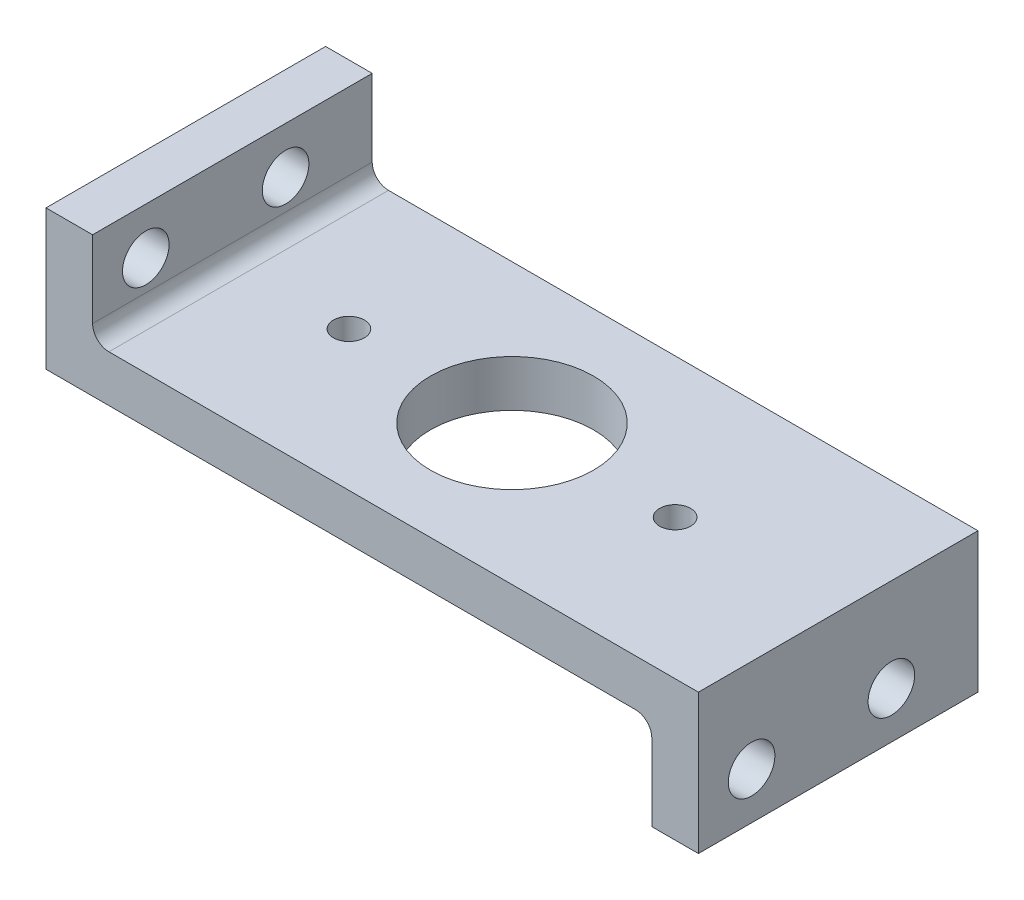
ISO-10303-21;
HEADER;
FILE_DESCRIPTION(('STEP AP214'),'2;1');
FILE_NAME('part.step','',(''),(''),'','','');
FILE_SCHEMA(('AUTOMOTIVE_DESIGN { 1 0 10303 214 1 1 1 1 }'));
ENDSEC;
DATA;
#1=APPLICATION_CONTEXT('core data for automotive mechanical design processes');
#2=APPLICATION_PROTOCOL_DEFINITION('international standard','automotive_design',2000,#1);
#3=PRODUCT_CONTEXT('',#1,'mechanical');
#4=PRODUCT('Part','Part','',(#3));
#5=PRODUCT_RELATED_PRODUCT_CATEGORY('part','',(#4));
#6=PRODUCT_DEFINITION_FORMATION('','',#4);
#7=PRODUCT_DEFINITION_CONTEXT('part definition',#1,'design');
#8=PRODUCT_DEFINITION('design','',#6,#7);
#9=PRODUCT_DEFINITION_SHAPE('','',#8);
#10=(LENGTH_UNIT() NAMED_UNIT(*) SI_UNIT(.MILLI.,.METRE.));
#11=(NAMED_UNIT(*) PLANE_ANGLE_UNIT() SI_UNIT($,.RADIAN.));
#12=(NAMED_UNIT(*) SI_UNIT($,.STERADIAN.) SOLID_ANGLE_UNIT());
#13=UNCERTAINTY_MEASURE_WITH_UNIT(LENGTH_MEASURE(1.E-05),#10,'distance_accuracy_value','');
#14=(GEOMETRIC_REPRESENTATION_CONTEXT(3) GLOBAL_UNCERTAINTY_ASSIGNED_CONTEXT((#13)) GLOBAL_UNIT_ASSIGNED_CONTEXT((#10,
#11,#12)) REPRESENTATION_CONTEXT('',''));
#15=CARTESIAN_POINT('',(0.,0.,0.));
#16=DIRECTION('',(0.,0.,1.));
#17=DIRECTION('',(1.,0.,0.));
#18=AXIS2_PLACEMENT_3D('',#15,#16,#17);
#19=CARTESIAN_POINT('',(-76.2,31.75,38.1));
#20=DIRECTION('',(0.,-1.,0.));
#21=DIRECTION('',(0.,0.,-1.));
#22=AXIS2_PLACEMENT_3D('',#19,#20,#21);
#23=PLANE('',#22);
#24=DIRECTION('',(-1.,0.,0.));
#25=VECTOR('',#24,1.);
#26=CARTESIAN_POINT('',(-76.2,31.75,-38.1));
#27=LINE('',#26,#25);
#28=CARTESIAN_POINT('',(-76.2,31.75,-38.1));
#29=VERTEX_POINT('',#28);
#30=CARTESIAN_POINT('',(-88.9,31.75,-38.1));
#31=VERTEX_POINT('',#30);
#32=EDGE_CURVE('E150',#29,#31,#27,.T.);
#33=ORIENTED_EDGE('',*,*,#32,.T.);
#34=DIRECTION('',(0.,0.,-1.));
#35=VECTOR('',#34,1.);
#36=CARTESIAN_POINT('',(-88.9,31.75,38.1));
#37=LINE('',#36,#35);
#38=CARTESIAN_POINT('',(-88.9,31.75,38.1));
#39=VERTEX_POINT('',#38);
#40=EDGE_CURVE('E11',#39,#31,#37,.T.);
#41=ORIENTED_EDGE('',*,*,#40,.F.);
#42=DIRECTION('',(-1.,0.,0.));
#43=VECTOR('',#42,1.);
#44=CARTESIAN_POINT('',(-76.2,31.75,38.1));
#45=LINE('',#44,#43);
#46=CARTESIAN_POINT('',(-76.2,31.75,38.1));
#47=VERTEX_POINT('',#46);
#48=EDGE_CURVE('E169',#47,#39,#45,.T.);
#49=ORIENTED_EDGE('',*,*,#48,.F.);
#50=DIRECTION('',(0.,0.,-1.));
#51=VECTOR('',#50,1.);
#52=CARTESIAN_POINT('',(-76.2,31.75,38.1));
#53=LINE('',#52,#51);
#54=EDGE_CURVE('E146',#47,#29,#53,.T.);
#55=ORIENTED_EDGE('',*,*,#54,.T.);
#56=EDGE_LOOP('',(#33,#41,#49,#55));
#57=FACE_BOUND('',#56,.T.);
#58=ADVANCED_FACE('F40',(#57),#23,.F.);
#59=CARTESIAN_POINT('',(-88.9,31.75,38.1));
#60=DIRECTION('',(1.,0.,0.));
#61=DIRECTION('',(0.,0.,-1.));
#62=AXIS2_PLACEMENT_3D('',#59,#60,#61);
#63=PLANE('',#62);
#64=CARTESIAN_POINT('',(-88.9,19.05,23.6064827259072));
#65=DIRECTION('',(1.,0.,0.));
#66=DIRECTION('',(0.,0.,-1.));
#67=AXIS2_PLACEMENT_3D('',#64,#65,#66);
#68=CIRCLE('',#67,6.34999999999997);
#69=CARTESIAN_POINT('',(-88.9,19.05,17.2564827259072));
#70=VERTEX_POINT('',#69);
#71=EDGE_CURVE('E195',#70,#70,#68,.T.);
#72=ORIENTED_EDGE('',*,*,#71,.T.);
#73=EDGE_LOOP('',(#72));
#74=FACE_BOUND('',#73,.T.);
#75=CARTESIAN_POINT('',(-88.9,19.05,-14.4935172740928));
#76=DIRECTION('',(1.,0.,0.));
#77=DIRECTION('',(0.,0.,-1.));
#78=AXIS2_PLACEMENT_3D('',#75,#76,#77);
#79=CIRCLE('',#78,6.34999999999997);
#80=CARTESIAN_POINT('',(-88.9,19.05,-20.8435172740928));
#81=VERTEX_POINT('',#80);
#82=EDGE_CURVE('E187',#81,#81,#79,.T.);
#83=ORIENTED_EDGE('',*,*,#82,.T.);
#84=EDGE_LOOP('',(#83));
#85=FACE_BOUND('',#84,.T.);
#86=DIRECTION('',(0.,-1.,0.));
#87=VECTOR('',#86,1.);
#88=CARTESIAN_POINT('',(-88.9,31.75,-38.1));
#89=LINE('',#88,#87);
#90=CARTESIAN_POINT('',(-88.9,-6.35,-38.1));
#91=VERTEX_POINT('',#90);
#92=EDGE_CURVE('E153',#31,#91,#89,.T.);
#93=ORIENTED_EDGE('',*,*,#92,.T.);
#94=DIRECTION('',(0.,0.,-1.));
#95=VECTOR('',#94,1.);
#96=CARTESIAN_POINT('',(-88.9,-6.35,38.1));
#97=LINE('',#96,#95);
#98=CARTESIAN_POINT('',(-88.9,-6.35,38.1));
#99=VERTEX_POINT('',#98);
#100=EDGE_CURVE('E49',#99,#91,#97,.T.);
#101=ORIENTED_EDGE('',*,*,#100,.F.);
#102=DIRECTION('',(0.,-1.,0.));
#103=VECTOR('',#102,1.);
#104=CARTESIAN_POINT('',(-88.9,31.75,38.1));
#105=LINE('',#104,#103);
#106=EDGE_CURVE('E107',#39,#99,#105,.T.);
#107=ORIENTED_EDGE('',*,*,#106,.F.);
#108=ORIENTED_EDGE('',*,*,#40,.T.);
#109=EDGE_LOOP('',(#93,#101,#107,#108));
#110=FACE_BOUND('',#109,.T.);
#111=ADVANCED_FACE('F237',(#74,#85,#110),#63,.F.);
#112=CARTESIAN_POINT('',(-88.9,-6.35,38.1));
#113=DIRECTION('',(0.,1.,0.));
#114=DIRECTION('',(0.,0.,1.));
#115=AXIS2_PLACEMENT_3D('',#112,#113,#114);
#116=PLANE('',#115);
#117=CARTESIAN_POINT('',(44.45,-6.35,0.));
#118=DIRECTION('',(0.,1.,0.));
#119=DIRECTION('',(0.,0.,1.));
#120=AXIS2_PLACEMENT_3D('',#117,#118,#119);
#121=CIRCLE('',#120,4.21639999999999);
#122=CARTESIAN_POINT('',(44.45,-6.35,4.21639999999999));
#123=VERTEX_POINT('',#122);
#124=EDGE_CURVE('E415',#123,#123,#121,.T.);
#125=ORIENTED_EDGE('',*,*,#124,.T.);
#126=EDGE_LOOP('',(#125));
#127=FACE_BOUND('',#126,.T.);
#128=CARTESIAN_POINT('',(-44.45,-6.35,0.));
#129=DIRECTION('',(0.,1.,0.));
#130=DIRECTION('',(0.,0.,1.));
#131=AXIS2_PLACEMENT_3D('',#128,#129,#130);
#132=CIRCLE('',#131,4.21639999999999);
#133=CARTESIAN_POINT('',(-44.45,-6.35,4.21639999999999));
#134=VERTEX_POINT('',#133);
#135=EDGE_CURVE('E280',#134,#134,#132,.T.);
#136=ORIENTED_EDGE('',*,*,#135,.T.);
#137=EDGE_LOOP('',(#136));
#138=FACE_BOUND('',#137,.T.);
#139=CARTESIAN_POINT('',(0.,-6.35,0.));
#140=DIRECTION('',(0.,1.,0.));
#141=DIRECTION('',(0.,0.,1.));
#142=AXIS2_PLACEMENT_3D('',#139,#140,#141);
#143=CIRCLE('',#142,22.225);
#144=CARTESIAN_POINT('',(0.,-6.35,22.225));
#145=VERTEX_POINT('',#144);
#146=EDGE_CURVE('E279',#145,#145,#143,.T.);
#147=ORIENTED_EDGE('',*,*,#146,.T.);
#148=EDGE_LOOP('',(#147));
#149=FACE_BOUND('',#148,.T.);
#150=DIRECTION('',(1.,0.,0.));
#151=VECTOR('',#150,1.);
#152=CARTESIAN_POINT('',(-88.9,-6.35,-38.1));
#153=LINE('',#152,#151);
#154=CARTESIAN_POINT('',(71.755,-6.35,-38.1));
#155=VERTEX_POINT('',#154);
#156=EDGE_CURVE('E156',#91,#155,#153,.T.);
#157=ORIENTED_EDGE('',*,*,#156,.T.);
#158=DIRECTION('',(0.,0.,-1.));
#159=VECTOR('',#158,1.);
#160=CARTESIAN_POINT('',(71.755,-6.35,38.1));
#161=LINE('',#160,#159);
#162=CARTESIAN_POINT('',(71.755,-6.35,38.1));
#163=VERTEX_POINT('',#162);
#164=EDGE_CURVE('E182',#163,#155,#161,.T.);
#165=ORIENTED_EDGE('',*,*,#164,.F.);
#166=DIRECTION('',(1.,0.,0.));
#167=VECTOR('',#166,1.);
#168=CARTESIAN_POINT('',(-88.9,-6.35,38.1));
#169=LINE('',#168,#167);
#170=EDGE_CURVE('E201',#99,#163,#169,.T.);
#171=ORIENTED_EDGE('',*,*,#170,.F.);
#172=ORIENTED_EDGE('',*,*,#100,.T.);
#173=EDGE_LOOP('',(#157,#165,#171,#172));
#174=FACE_BOUND('',#173,.T.);
#175=ADVANCED_FACE('F241',(#127,#138,#149,#174),#116,.F.);
#176=CARTESIAN_POINT('',(71.755,-10.795,38.1));
#177=DIRECTION('',(0.,0.,-1.));
#178=DIRECTION('',(-1.,0.,0.));
#179=AXIS2_PLACEMENT_3D('',#176,#177,#178);
#180=CYLINDRICAL_SURFACE('',#179,4.445);
#181=CARTESIAN_POINT('',(71.755,-10.795,-38.1));
#182=DIRECTION('',(0.,0.,-1.));
#183=DIRECTION('',(-1.,0.,0.));
#184=AXIS2_PLACEMENT_3D('',#181,#182,#183);
#185=CIRCLE('',#184,4.445);
#186=CARTESIAN_POINT('',(76.2,-10.795,-38.1));
#187=VERTEX_POINT('',#186);
#188=EDGE_CURVE('E158',#155,#187,#185,.T.);
#189=ORIENTED_EDGE('',*,*,#188,.T.);
#190=DIRECTION('',(0.,0.,-1.));
#191=VECTOR('',#190,1.);
#192=CARTESIAN_POINT('',(76.2,-10.795,38.1));
#193=LINE('',#192,#191);
#194=CARTESIAN_POINT('',(76.2,-10.795,38.1));
#195=VERTEX_POINT('',#194);
#196=EDGE_CURVE('E179',#195,#187,#193,.T.);
#197=ORIENTED_EDGE('',*,*,#196,.F.);
#198=CARTESIAN_POINT('',(71.755,-10.795,38.1));
#199=DIRECTION('',(0.,0.,-1.));
#200=DIRECTION('',(-1.,0.,0.));
#201=AXIS2_PLACEMENT_3D('',#198,#199,#200);
#202=CIRCLE('',#201,4.445);
#203=EDGE_CURVE('E203',#163,#195,#202,.T.);
#204=ORIENTED_EDGE('',*,*,#203,.F.);
#205=ORIENTED_EDGE('',*,*,#164,.T.);
#206=EDGE_LOOP('',(#189,#197,#204,#205));
#207=FACE_BOUND('',#206,.T.);
#208=ADVANCED_FACE('F246',(#207),#180,.F.);
#209=CARTESIAN_POINT('',(76.2,-10.795,38.1));
#210=DIRECTION('',(1.,0.,0.));
#211=DIRECTION('',(0.,0.,-1.));
#212=AXIS2_PLACEMENT_3D('',#209,#210,#211);
#213=PLANE('',#212);
#214=CARTESIAN_POINT('',(76.2,-19.05,23.6064827259072));
#215=DIRECTION('',(1.,0.,0.));
#216=DIRECTION('',(0.,0.,-1.));
#217=AXIS2_PLACEMENT_3D('',#214,#215,#216);
#218=CIRCLE('',#217,6.34999999999999);
#219=CARTESIAN_POINT('',(76.2,-19.05,17.2564827259072));
#220=VERTEX_POINT('',#219);
#221=EDGE_CURVE('E291',#220,#220,#218,.T.);
#222=ORIENTED_EDGE('',*,*,#221,.T.);
#223=EDGE_LOOP('',(#222));
#224=FACE_BOUND('',#223,.T.);
#225=CARTESIAN_POINT('',(76.2,-19.05,-14.4935172740928));
#226=DIRECTION('',(1.,0.,0.));
#227=DIRECTION('',(0.,0.,-1.));
#228=AXIS2_PLACEMENT_3D('',#225,#226,#227);
#229=CIRCLE('',#228,6.34999999999999);
#230=CARTESIAN_POINT('',(76.2,-19.05,-20.8435172740928));
#231=VERTEX_POINT('',#230);
#232=EDGE_CURVE('E296',#231,#231,#229,.T.);
#233=ORIENTED_EDGE('',*,*,#232,.T.);
#234=EDGE_LOOP('',(#233));
#235=FACE_BOUND('',#234,.T.);
#236=DIRECTION('',(0.,-1.,0.));
#237=VECTOR('',#236,1.);
#238=CARTESIAN_POINT('',(76.2,-10.795,-38.1));
#239=LINE('',#238,#237);
#240=CARTESIAN_POINT('',(76.2,-31.75,-38.1));
#241=VERTEX_POINT('',#240);
#242=EDGE_CURVE('E160',#187,#241,#239,.T.);
#243=ORIENTED_EDGE('',*,*,#242,.T.);
#244=DIRECTION('',(0.,0.,-1.));
#245=VECTOR('',#244,1.);
#246=CARTESIAN_POINT('',(76.2,-31.75,38.1));
#247=LINE('',#246,#245);
#248=CARTESIAN_POINT('',(76.2,-31.75,38.1));
#249=VERTEX_POINT('',#248);
#250=EDGE_CURVE('E176',#249,#241,#247,.T.);
#251=ORIENTED_EDGE('',*,*,#250,.F.);
#252=DIRECTION('',(0.,-1.,0.));
#253=VECTOR('',#252,1.);
#254=CARTESIAN_POINT('',(76.2,-10.795,38.1));
#255=LINE('',#254,#253);
#256=EDGE_CURVE('E205',#195,#249,#255,.T.);
#257=ORIENTED_EDGE('',*,*,#256,.F.);
#258=ORIENTED_EDGE('',*,*,#196,.T.);
#259=EDGE_LOOP('',(#243,#251,#257,#258));
#260=FACE_BOUND('',#259,.T.);
#261=ADVANCED_FACE('F253',(#224,#235,#260),#213,.F.);
#262=CARTESIAN_POINT('',(76.2,-31.75,38.1));
#263=DIRECTION('',(0.,1.,0.));
#264=DIRECTION('',(0.,0.,1.));
#265=AXIS2_PLACEMENT_3D('',#262,#263,#264);
#266=PLANE('',#265);
#267=DIRECTION('',(1.,0.,0.));
#268=VECTOR('',#267,1.);
#269=CARTESIAN_POINT('',(76.2,-31.75,-38.1));
#270=LINE('',#269,#268);
#271=CARTESIAN_POINT('',(88.9,-31.75,-38.1));
#272=VERTEX_POINT('',#271);
#273=EDGE_CURVE('E162',#241,#272,#270,.T.);
#274=ORIENTED_EDGE('',*,*,#273,.T.);
#275=DIRECTION('',(0.,0.,-1.));
#276=VECTOR('',#275,1.);
#277=CARTESIAN_POINT('',(88.9,-31.75,38.1));
#278=LINE('',#277,#276);
#279=CARTESIAN_POINT('',(88.9,-31.75,38.1));
#280=VERTEX_POINT('',#279);
#281=EDGE_CURVE('E173',#280,#272,#278,.T.);
#282=ORIENTED_EDGE('',*,*,#281,.F.);
#283=DIRECTION('',(1.,0.,0.));
#284=VECTOR('',#283,1.);
#285=CARTESIAN_POINT('',(76.2,-31.75,38.1));
#286=LINE('',#285,#284);
#287=EDGE_CURVE('E207',#249,#280,#286,.T.);
#288=ORIENTED_EDGE('',*,*,#287,.F.);
#289=ORIENTED_EDGE('',*,*,#250,.T.);
#290=EDGE_LOOP('',(#274,#282,#288,#289));
#291=FACE_BOUND('',#290,.T.);
#292=ADVANCED_FACE('F213',(#291),#266,.F.);
#293=CARTESIAN_POINT('',(88.9,-31.75,38.1));
#294=DIRECTION('',(-1.,0.,0.));
#295=DIRECTION('',(0.,0.,1.));
#296=AXIS2_PLACEMENT_3D('',#293,#294,#295);
#297=PLANE('',#296);
#298=CARTESIAN_POINT('',(88.9,-19.05,23.6064827259072));
#299=DIRECTION('',(1.,0.,0.));
#300=DIRECTION('',(0.,0.,-1.));
#301=AXIS2_PLACEMENT_3D('',#298,#299,#300);
#302=CIRCLE('',#301,6.35);
#303=CARTESIAN_POINT('',(88.9,-19.05,17.2564827259072));
#304=VERTEX_POINT('',#303);
#305=EDGE_CURVE('E283',#304,#304,#302,.T.);
#306=ORIENTED_EDGE('',*,*,#305,.F.);
#307=EDGE_LOOP('',(#306));
#308=FACE_BOUND('',#307,.T.);
#309=CARTESIAN_POINT('',(88.9,-19.05,-14.4935172740928));
#310=DIRECTION('',(1.,0.,0.));
#311=DIRECTION('',(0.,0.,-1.));
#312=AXIS2_PLACEMENT_3D('',#309,#310,#311);
#313=CIRCLE('',#312,6.35);
#314=CARTESIAN_POINT('',(88.9,-19.05,-20.8435172740928));
#315=VERTEX_POINT('',#314);
#316=EDGE_CURVE('E294',#315,#315,#313,.T.);
#317=ORIENTED_EDGE('',*,*,#316,.F.);
#318=EDGE_LOOP('',(#317));
#319=FACE_BOUND('',#318,.T.);
#320=DIRECTION('',(0.,1.,0.));
#321=VECTOR('',#320,1.);
#322=CARTESIAN_POINT('',(88.9,-31.75,-38.1));
#323=LINE('',#322,#321);
#324=CARTESIAN_POINT('',(88.9,6.35000000000001,-38.1));
#325=VERTEX_POINT('',#324);
#326=EDGE_CURVE('E164',#272,#325,#323,.T.);
#327=ORIENTED_EDGE('',*,*,#326,.T.);
#328=DIRECTION('',(0.,0.,-1.));
#329=VECTOR('',#328,1.);
#330=CARTESIAN_POINT('',(88.9,6.35000000000001,38.1));
#331=LINE('',#330,#329);
#332=CARTESIAN_POINT('',(88.9,6.35000000000001,38.1));
#333=VERTEX_POINT('',#332);
#334=EDGE_CURVE('E141',#333,#325,#331,.T.);
#335=ORIENTED_EDGE('',*,*,#334,.F.);
#336=DIRECTION('',(0.,1.,0.));
#337=VECTOR('',#336,1.);
#338=CARTESIAN_POINT('',(88.9,-31.75,38.1));
#339=LINE('',#338,#337);
#340=EDGE_CURVE('E132',#280,#333,#339,.T.);
#341=ORIENTED_EDGE('',*,*,#340,.F.);
#342=ORIENTED_EDGE('',*,*,#281,.T.);
#343=EDGE_LOOP('',(#327,#335,#341,#342));
#344=FACE_BOUND('',#343,.T.);
#345=ADVANCED_FACE('F217',(#308,#319,#344),#297,.F.);
#346=CARTESIAN_POINT('',(88.9,6.35000000000001,38.1));
#347=DIRECTION('',(0.,-1.,0.));
#348=DIRECTION('',(1.,0.,0.));
#349=AXIS2_PLACEMENT_3D('',#346,#347,#348);
#350=PLANE('',#349);
#351=CARTESIAN_POINT('',(44.45,6.35000000000001,0.));
#352=DIRECTION('',(0.,1.,0.));
#353=DIRECTION('',(0.,0.,1.));
#354=AXIS2_PLACEMENT_3D('',#351,#352,#353);
#355=CIRCLE('',#354,4.21639999999999);
#356=CARTESIAN_POINT('',(44.45,6.35000000000001,4.21639999999999));
#357=VERTEX_POINT('',#356);
#358=EDGE_CURVE('E270',#357,#357,#355,.T.);
#359=ORIENTED_EDGE('',*,*,#358,.F.);
#360=EDGE_LOOP('',(#359));
#361=FACE_BOUND('',#360,.T.);
#362=CARTESIAN_POINT('',(-44.45,6.35,0.));
#363=DIRECTION('',(0.,1.,0.));
#364=DIRECTION('',(0.,0.,1.));
#365=AXIS2_PLACEMENT_3D('',#362,#363,#364);
#366=CIRCLE('',#365,4.21639999999999);
#367=CARTESIAN_POINT('',(-44.45,6.35,4.21639999999999));
#368=VERTEX_POINT('',#367);
#369=EDGE_CURVE('E274',#368,#368,#366,.T.);
#370=ORIENTED_EDGE('',*,*,#369,.F.);
#371=EDGE_LOOP('',(#370));
#372=FACE_BOUND('',#371,.T.);
#373=CARTESIAN_POINT('',(0.,6.35,0.));
#374=DIRECTION('',(0.,1.,0.));
#375=DIRECTION('',(-1.,0.,0.));
#376=AXIS2_PLACEMENT_3D('',#373,#374,#375);
#377=CIRCLE('',#376,22.225);
#378=CARTESIAN_POINT('',(-22.225,6.35,0.));
#379=VERTEX_POINT('',#378);
#380=EDGE_CURVE('E277',#379,#379,#377,.T.);
#381=ORIENTED_EDGE('',*,*,#380,.F.);
#382=EDGE_LOOP('',(#381));
#383=FACE_BOUND('',#382,.T.);
#384=DIRECTION('',(-1.,0.,0.));
#385=VECTOR('',#384,1.);
#386=CARTESIAN_POINT('',(88.9,6.35000000000001,-38.1));
#387=LINE('',#386,#385);
#388=CARTESIAN_POINT('',(-71.755,6.34999999999999,-38.1));
#389=VERTEX_POINT('',#388);
#390=EDGE_CURVE('E140',#325,#389,#387,.T.);
#391=ORIENTED_EDGE('',*,*,#390,.T.);
#392=DIRECTION('',(0.,0.,-1.));
#393=VECTOR('',#392,1.);
#394=CARTESIAN_POINT('',(-71.755,6.34999999999999,38.1));
#395=LINE('',#394,#393);
#396=CARTESIAN_POINT('',(-71.755,6.34999999999999,38.1));
#397=VERTEX_POINT('',#396);
#398=EDGE_CURVE('E137',#397,#389,#395,.T.);
#399=ORIENTED_EDGE('',*,*,#398,.F.);
#400=DIRECTION('',(-1.,0.,0.));
#401=VECTOR('',#400,1.);
#402=CARTESIAN_POINT('',(88.9,6.35000000000001,38.1));
#403=LINE('',#402,#401);
#404=EDGE_CURVE('E126',#333,#397,#403,.T.);
#405=ORIENTED_EDGE('',*,*,#404,.F.);
#406=ORIENTED_EDGE('',*,*,#334,.T.);
#407=EDGE_LOOP('',(#391,#399,#405,#406));
#408=FACE_BOUND('',#407,.T.);
#409=ADVANCED_FACE('F138',(#361,#372,#383,#408),#350,.F.);
#410=CARTESIAN_POINT('',(-71.755,10.795,38.1));
#411=DIRECTION('',(0.,0.,-1.));
#412=DIRECTION('',(-1.,0.,0.));
#413=AXIS2_PLACEMENT_3D('',#410,#411,#412);
#414=CYLINDRICAL_SURFACE('',#413,4.445);
#415=CARTESIAN_POINT('',(-71.755,10.795,-38.1));
#416=DIRECTION('',(0.,0.,-1.));
#417=DIRECTION('',(-1.,0.,0.));
#418=AXIS2_PLACEMENT_3D('',#415,#416,#417);
#419=CIRCLE('',#418,4.445);
#420=CARTESIAN_POINT('',(-76.2,10.795,-38.1));
#421=VERTEX_POINT('',#420);
#422=EDGE_CURVE('E93',#389,#421,#419,.T.);
#423=ORIENTED_EDGE('',*,*,#422,.T.);
#424=DIRECTION('',(0.,0.,-1.));
#425=VECTOR('',#424,1.);
#426=CARTESIAN_POINT('',(-76.2,10.795,38.1));
#427=LINE('',#426,#425);
#428=CARTESIAN_POINT('',(-76.2,10.795,38.1));
#429=VERTEX_POINT('',#428);
#430=EDGE_CURVE('E142',#429,#421,#427,.T.);
#431=ORIENTED_EDGE('',*,*,#430,.F.);
#432=CARTESIAN_POINT('',(-71.755,10.795,38.1));
#433=DIRECTION('',(0.,0.,-1.));
#434=DIRECTION('',(-1.,0.,0.));
#435=AXIS2_PLACEMENT_3D('',#432,#433,#434);
#436=CIRCLE('',#435,4.445);
#437=EDGE_CURVE('E130',#397,#429,#436,.T.);
#438=ORIENTED_EDGE('',*,*,#437,.F.);
#439=ORIENTED_EDGE('',*,*,#398,.T.);
#440=EDGE_LOOP('',(#423,#431,#438,#439));
#441=FACE_BOUND('',#440,.T.);
#442=ADVANCED_FACE('F144',(#441),#414,.F.);
#443=CARTESIAN_POINT('',(-76.2,10.795,38.1));
#444=DIRECTION('',(-1.,0.,0.));
#445=DIRECTION('',(0.,0.,1.));
#446=AXIS2_PLACEMENT_3D('',#443,#444,#445);
#447=PLANE('',#446);
#448=CARTESIAN_POINT('',(-76.2,19.05,23.6064827259072));
#449=DIRECTION('',(-1.,0.,0.));
#450=DIRECTION('',(0.,0.,1.));
#451=AXIS2_PLACEMENT_3D('',#448,#449,#450);
#452=CIRCLE('',#451,6.34999999999999);
#453=CARTESIAN_POINT('',(-76.2,19.05,29.9564827259072));
#454=VERTEX_POINT('',#453);
#455=EDGE_CURVE('E43',#454,#454,#452,.T.);
#456=ORIENTED_EDGE('',*,*,#455,.T.);
#457=EDGE_LOOP('',(#456));
#458=FACE_BOUND('',#457,.T.);
#459=CARTESIAN_POINT('',(-76.2,19.05,-14.4935172740928));
#460=DIRECTION('',(-1.,0.,0.));
#461=DIRECTION('',(0.,0.,1.));
#462=AXIS2_PLACEMENT_3D('',#459,#460,#461);
#463=CIRCLE('',#462,6.34999999999999);
#464=CARTESIAN_POINT('',(-76.2,19.05,-8.14351727409284));
#465=VERTEX_POINT('',#464);
#466=EDGE_CURVE('E154',#465,#465,#463,.T.);
#467=ORIENTED_EDGE('',*,*,#466,.T.);
#468=EDGE_LOOP('',(#467));
#469=FACE_BOUND('',#468,.T.);
#470=DIRECTION('',(0.,1.,0.));
#471=VECTOR('',#470,1.);
#472=CARTESIAN_POINT('',(-76.2,10.795,-38.1));
#473=LINE('',#472,#471);
#474=EDGE_CURVE('E99',#421,#29,#473,.T.);
#475=ORIENTED_EDGE('',*,*,#474,.T.);
#476=ORIENTED_EDGE('',*,*,#54,.F.);
#477=DIRECTION('',(0.,1.,0.));
#478=VECTOR('',#477,1.);
#479=CARTESIAN_POINT('',(-76.2,10.795,38.1));
#480=LINE('',#479,#478);
#481=EDGE_CURVE('E58',#429,#47,#480,.T.);
#482=ORIENTED_EDGE('',*,*,#481,.F.);
#483=ORIENTED_EDGE('',*,*,#430,.T.);
#484=EDGE_LOOP('',(#475,#476,#482,#483));
#485=FACE_BOUND('',#484,.T.);
#486=ADVANCED_FACE('F225',(#458,#469,#485),#447,.F.);
#487=CARTESIAN_POINT('',(71.755,-10.795,38.1));
#488=DIRECTION('',(0.,0.,-1.));
#489=DIRECTION('',(-1.,0.,0.));
#490=AXIS2_PLACEMENT_3D('',#487,#488,#489);
#491=PLANE('',#490);
#492=ORIENTED_EDGE('',*,*,#48,.T.);
#493=ORIENTED_EDGE('',*,*,#106,.T.);
#494=ORIENTED_EDGE('',*,*,#170,.T.);
#495=ORIENTED_EDGE('',*,*,#203,.T.);
#496=ORIENTED_EDGE('',*,*,#256,.T.);
#497=ORIENTED_EDGE('',*,*,#287,.T.);
#498=ORIENTED_EDGE('',*,*,#340,.T.);
#499=ORIENTED_EDGE('',*,*,#404,.T.);
#500=ORIENTED_EDGE('',*,*,#437,.T.);
#501=ORIENTED_EDGE('',*,*,#481,.T.);
#502=EDGE_LOOP('',(#492,#493,#494,#495,#496,#497,#498,#499,#500,#501));
#503=FACE_BOUND('',#502,.T.);
#504=ADVANCED_FACE('F128',(#503),#491,.F.);
#505=CARTESIAN_POINT('',(71.755,-10.795,-38.1));
#506=DIRECTION('',(0.,0.,-1.));
#507=DIRECTION('',(-1.,0.,0.));
#508=AXIS2_PLACEMENT_3D('',#505,#506,#507);
#509=PLANE('',#508);
#510=ORIENTED_EDGE('',*,*,#32,.F.);
#511=ORIENTED_EDGE('',*,*,#474,.F.);
#512=ORIENTED_EDGE('',*,*,#422,.F.);
#513=ORIENTED_EDGE('',*,*,#390,.F.);
#514=ORIENTED_EDGE('',*,*,#326,.F.);
#515=ORIENTED_EDGE('',*,*,#273,.F.);
#516=ORIENTED_EDGE('',*,*,#242,.F.);
#517=ORIENTED_EDGE('',*,*,#188,.F.);
#518=ORIENTED_EDGE('',*,*,#156,.F.);
#519=ORIENTED_EDGE('',*,*,#92,.F.);
#520=EDGE_LOOP('',(#510,#511,#512,#513,#514,#515,#516,#517,#518,#519));
#521=FACE_BOUND('',#520,.T.);
#522=ADVANCED_FACE('F220',(#521),#509,.T.);
#523=CARTESIAN_POINT('',(88.9,19.05,-14.4935172740928));
#524=DIRECTION('',(1.,0.,0.));
#525=DIRECTION('',(0.,0.,-1.));
#526=AXIS2_PLACEMENT_3D('',#523,#524,#525);
#527=CYLINDRICAL_SURFACE('',#526,6.34999999999999);
#528=ORIENTED_EDGE('',*,*,#82,.F.);
#529=EDGE_LOOP('',(#528));
#530=FACE_BOUND('',#529,.T.);
#531=ORIENTED_EDGE('',*,*,#466,.F.);
#532=EDGE_LOOP('',(#531));
#533=FACE_BOUND('',#532,.T.);
#534=ADVANCED_FACE('F306',(#530,#533),#527,.F.);
#535=CARTESIAN_POINT('',(88.9,19.05,23.6064827259072));
#536=DIRECTION('',(1.,0.,0.));
#537=DIRECTION('',(0.,0.,-1.));
#538=AXIS2_PLACEMENT_3D('',#535,#536,#537);
#539=CYLINDRICAL_SURFACE('',#538,6.34999999999999);
#540=ORIENTED_EDGE('',*,*,#71,.F.);
#541=EDGE_LOOP('',(#540));
#542=FACE_BOUND('',#541,.T.);
#543=ORIENTED_EDGE('',*,*,#455,.F.);
#544=EDGE_LOOP('',(#543));
#545=FACE_BOUND('',#544,.T.);
#546=ADVANCED_FACE('F302',(#542,#545),#539,.F.);
#547=CARTESIAN_POINT('',(88.9,-19.05,-14.4935172740928));
#548=DIRECTION('',(1.,0.,0.));
#549=DIRECTION('',(0.,0.,-1.));
#550=AXIS2_PLACEMENT_3D('',#547,#548,#549);
#551=CYLINDRICAL_SURFACE('',#550,6.34999999999999);
#552=ORIENTED_EDGE('',*,*,#316,.T.);
#553=EDGE_LOOP('',(#552));
#554=FACE_BOUND('',#553,.T.);
#555=ORIENTED_EDGE('',*,*,#232,.F.);
#556=EDGE_LOOP('',(#555));
#557=FACE_BOUND('',#556,.T.);
#558=ADVANCED_FACE('F305',(#554,#557),#551,.F.);
#559=CARTESIAN_POINT('',(88.9,-19.05,23.6064827259072));
#560=DIRECTION('',(1.,0.,0.));
#561=DIRECTION('',(0.,0.,-1.));
#562=AXIS2_PLACEMENT_3D('',#559,#560,#561);
#563=CYLINDRICAL_SURFACE('',#562,6.34999999999999);
#564=ORIENTED_EDGE('',*,*,#305,.T.);
#565=EDGE_LOOP('',(#564));
#566=FACE_BOUND('',#565,.T.);
#567=ORIENTED_EDGE('',*,*,#221,.F.);
#568=EDGE_LOOP('',(#567));
#569=FACE_BOUND('',#568,.T.);
#570=ADVANCED_FACE('F313',(#566,#569),#563,.F.);
#571=CARTESIAN_POINT('',(0.,-31.75,0.));
#572=DIRECTION('',(0.,1.,0.));
#573=DIRECTION('',(-1.,0.,0.));
#574=AXIS2_PLACEMENT_3D('',#571,#572,#573);
#575=CYLINDRICAL_SURFACE('',#574,22.225);
#576=ORIENTED_EDGE('',*,*,#380,.T.);
#577=EDGE_LOOP('',(#576));
#578=FACE_BOUND('',#577,.T.);
#579=ORIENTED_EDGE('',*,*,#146,.F.);
#580=EDGE_LOOP('',(#579));
#581=FACE_BOUND('',#580,.T.);
#582=ADVANCED_FACE('F350',(#578,#581),#575,.F.);
#583=CARTESIAN_POINT('',(-44.45,6.34999999999999,0.));
#584=DIRECTION('',(0.,1.,0.));
#585=DIRECTION('',(0.,0.,1.));
#586=AXIS2_PLACEMENT_3D('',#583,#584,#585);
#587=CYLINDRICAL_SURFACE('',#586,4.21639999999999);
#588=ORIENTED_EDGE('',*,*,#369,.T.);
#589=EDGE_LOOP('',(#588));
#590=FACE_BOUND('',#589,.T.);
#591=ORIENTED_EDGE('',*,*,#135,.F.);
#592=EDGE_LOOP('',(#591));
#593=FACE_BOUND('',#592,.T.);
#594=ADVANCED_FACE('F359',(#590,#593),#587,.F.);
#595=CARTESIAN_POINT('',(44.45,6.35,0.));
#596=DIRECTION('',(0.,1.,0.));
#597=DIRECTION('',(0.,0.,1.));
#598=AXIS2_PLACEMENT_3D('',#595,#596,#597);
#599=CYLINDRICAL_SURFACE('',#598,4.21639999999999);
#600=ORIENTED_EDGE('',*,*,#358,.T.);
#601=EDGE_LOOP('',(#600));
#602=FACE_BOUND('',#601,.T.);
#603=ORIENTED_EDGE('',*,*,#124,.F.);
#604=EDGE_LOOP('',(#603));
#605=FACE_BOUND('',#604,.T.);
#606=ADVANCED_FACE('F388',(#602,#605),#599,.F.);
#607=CLOSED_SHELL('',(#58,#111,#175,#208,#261,#292,#345,#409,#442,#486,#504,#522,#534,#546,#558,
#570,#582,#594,#606));
#608=MANIFOLD_SOLID_BREP('B2',#607);
#609=ADVANCED_BREP_SHAPE_REPRESENTATION('',(#18,#608),#14);
#610=SHAPE_DEFINITION_REPRESENTATION(#9,#609);
ENDSEC;
END-ISO-10303-21;
